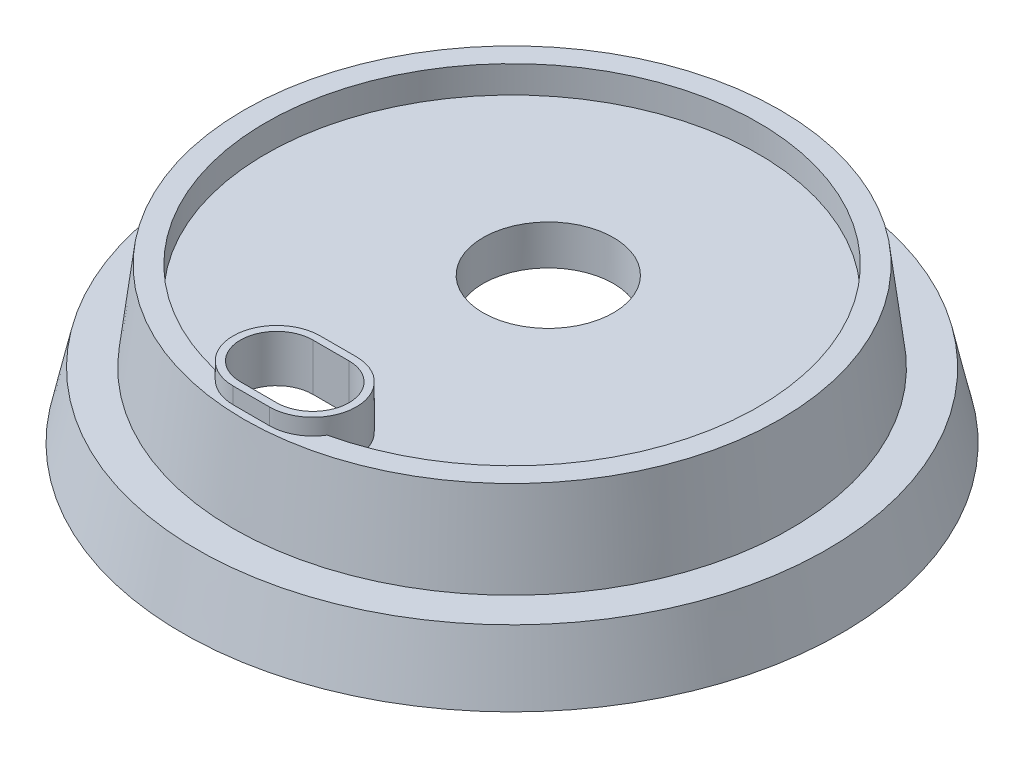
ISO-10303-21;
HEADER;
FILE_DESCRIPTION(('STEP AP214'),'2;1');
FILE_NAME('part.step','',(''),(''),'','','');
FILE_SCHEMA(('AUTOMOTIVE_DESIGN { 1 0 10303 214 1 1 1 1 }'));
ENDSEC;
DATA;
#1=APPLICATION_CONTEXT('core data for automotive mechanical design processes');
#2=APPLICATION_PROTOCOL_DEFINITION('international standard','automotive_design',2000,#1);
#3=PRODUCT_CONTEXT('',#1,'mechanical');
#4=PRODUCT('Part','Part','',(#3));
#5=PRODUCT_RELATED_PRODUCT_CATEGORY('part','',(#4));
#6=PRODUCT_DEFINITION_FORMATION('','',#4);
#7=PRODUCT_DEFINITION_CONTEXT('part definition',#1,'design');
#8=PRODUCT_DEFINITION('design','',#6,#7);
#9=PRODUCT_DEFINITION_SHAPE('','',#8);
#10=(LENGTH_UNIT() NAMED_UNIT(*) SI_UNIT(.MILLI.,.METRE.));
#11=(NAMED_UNIT(*) PLANE_ANGLE_UNIT() SI_UNIT($,.RADIAN.));
#12=(NAMED_UNIT(*) SI_UNIT($,.STERADIAN.) SOLID_ANGLE_UNIT());
#13=UNCERTAINTY_MEASURE_WITH_UNIT(LENGTH_MEASURE(1.E-05),#10,'distance_accuracy_value','');
#14=(GEOMETRIC_REPRESENTATION_CONTEXT(3) GLOBAL_UNCERTAINTY_ASSIGNED_CONTEXT((#13)) GLOBAL_UNIT_ASSIGNED_CONTEXT((#10,
#11,#12)) REPRESENTATION_CONTEXT('',''));
#15=CARTESIAN_POINT('',(0.,0.,0.));
#16=DIRECTION('',(0.,0.,1.));
#17=DIRECTION('',(1.,0.,0.));
#18=AXIS2_PLACEMENT_3D('',#15,#16,#17);
#19=CARTESIAN_POINT('',(0.,8.05,0.));
#20=DIRECTION('',(0.,-1.,0.));
#21=DIRECTION('',(0.,0.,-1.));
#22=AXIS2_PLACEMENT_3D('',#19,#20,#21);
#23=PLANE('',#22);
#24=CARTESIAN_POINT('',(2.5,8.05,30.));
#25=DIRECTION('',(0.,-1.,0.));
#26=DIRECTION('',(0.,0.,-1.));
#27=AXIS2_PLACEMENT_3D('',#24,#25,#26);
#28=CIRCLE('',#27,5.);
#29=CARTESIAN_POINT('',(2.5,8.05,25.));
#30=VERTEX_POINT('',#29);
#31=CARTESIAN_POINT('',(5.3969469058846,8.05,34.0752544245096));
#32=VERTEX_POINT('',#31);
#33=EDGE_CURVE('E63',#30,#32,#28,.T.);
#34=ORIENTED_EDGE('',*,*,#33,.F.);
#35=DIRECTION('',(1.,0.,0.));
#36=VECTOR('',#35,1.);
#37=CARTESIAN_POINT('',(0.,8.05,25.));
#38=LINE('',#37,#36);
#39=CARTESIAN_POINT('',(-2.5,8.05,25.));
#40=VERTEX_POINT('',#39);
#41=EDGE_CURVE('E163',#40,#30,#38,.T.);
#42=ORIENTED_EDGE('',*,*,#41,.F.);
#43=CARTESIAN_POINT('',(-2.5,8.05,30.));
#44=DIRECTION('',(0.,-1.,0.));
#45=DIRECTION('',(0.,0.,-1.));
#46=AXIS2_PLACEMENT_3D('',#43,#44,#45);
#47=CIRCLE('',#46,5.);
#48=CARTESIAN_POINT('',(-5.39694690588459,8.05,34.0752544245096));
#49=VERTEX_POINT('',#48);
#50=EDGE_CURVE('E289',#49,#40,#47,.T.);
#51=ORIENTED_EDGE('',*,*,#50,.F.);
#52=CARTESIAN_POINT('',(0.,8.05,0.));
#53=DIRECTION('',(0.,-1.,0.));
#54=DIRECTION('',(0.,0.,-1.));
#55=AXIS2_PLACEMENT_3D('',#52,#53,#54);
#56=CIRCLE('',#55,34.5);
#57=EDGE_CURVE('E325',#49,#32,#56,.T.);
#58=ORIENTED_EDGE('',*,*,#57,.T.);
#59=EDGE_LOOP('',(#34,#42,#51,#58));
#60=FACE_BOUND('',#59,.T.);
#61=CARTESIAN_POINT('',(0.,8.05,-5.));
#62=DIRECTION('',(0.,-1.,0.));
#63=DIRECTION('',(0.,0.,-1.));
#64=AXIS2_PLACEMENT_3D('',#61,#62,#63);
#65=CIRCLE('',#64,10.);
#66=CARTESIAN_POINT('',(0.,8.05,-15.));
#67=VERTEX_POINT('',#66);
#68=EDGE_CURVE('E527',#67,#67,#65,.T.);
#69=ORIENTED_EDGE('',*,*,#68,.F.);
#70=EDGE_LOOP('',(#69));
#71=FACE_BOUND('',#70,.T.);
#72=ADVANCED_FACE('F39',(#60,#71),#23,.T.);
#73=CARTESIAN_POINT('',(37.,12.3,0.));
#74=DIRECTION('',(0.,1.,0.));
#75=DIRECTION('',(0.,0.,1.));
#76=AXIS2_PLACEMENT_3D('',#73,#74,#75);
#77=PLANE('',#76);
#78=CARTESIAN_POINT('',(0.,12.3,0.));
#79=DIRECTION('',(0.,-1.,0.));
#80=DIRECTION('',(0.,0.,-1.));
#81=AXIS2_PLACEMENT_3D('',#78,#79,#80);
#82=CIRCLE('',#81,37.);
#83=CARTESIAN_POINT('',(0.,12.3,-37.));
#84=VERTEX_POINT('',#83);
#85=EDGE_CURVE('E337',#84,#84,#82,.T.);
#86=ORIENTED_EDGE('',*,*,#85,.F.);
#87=EDGE_LOOP('',(#86));
#88=FACE_BOUND('',#87,.T.);
#89=DIRECTION('',(-1.,0.,0.));
#90=VECTOR('',#89,1.);
#91=CARTESIAN_POINT('',(37.,12.3,36.));
#92=LINE('',#91,#90);
#93=CARTESIAN_POINT('',(2.5,12.3,36.));
#94=VERTEX_POINT('',#93);
#95=CARTESIAN_POINT('',(-2.5,12.3,36.));
#96=VERTEX_POINT('',#95);
#97=EDGE_CURVE('E264',#94,#96,#92,.T.);
#98=ORIENTED_EDGE('',*,*,#97,.T.);
#99=CARTESIAN_POINT('',(-2.5,12.3,30.));
#100=DIRECTION('',(0.,1.,0.));
#101=DIRECTION('',(0.,0.,1.));
#102=AXIS2_PLACEMENT_3D('',#99,#100,#101);
#103=CIRCLE('',#102,6.);
#104=CARTESIAN_POINT('',(-7.61507323691547,12.3,33.1362438969237));
#105=VERTEX_POINT('',#104);
#106=EDGE_CURVE('E166',#96,#105,#103,.F.);
#107=ORIENTED_EDGE('',*,*,#106,.T.);
#108=CARTESIAN_POINT('',(0.,12.3,0.));
#109=DIRECTION('',(0.,-1.,0.));
#110=DIRECTION('',(0.,0.,-1.));
#111=AXIS2_PLACEMENT_3D('',#108,#109,#110);
#112=CIRCLE('',#111,34.);
#113=CARTESIAN_POINT('',(7.61507323691545,12.3,33.1362438969237));
#114=VERTEX_POINT('',#113);
#115=EDGE_CURVE('E333',#105,#114,#112,.T.);
#116=ORIENTED_EDGE('',*,*,#115,.T.);
#117=CARTESIAN_POINT('',(2.5,12.3,30.));
#118=DIRECTION('',(0.,1.,0.));
#119=DIRECTION('',(0.,0.,1.));
#120=AXIS2_PLACEMENT_3D('',#117,#118,#119);
#121=CIRCLE('',#120,6.);
#122=EDGE_CURVE('E260',#114,#94,#121,.F.);
#123=ORIENTED_EDGE('',*,*,#122,.T.);
#124=EDGE_LOOP('',(#98,#107,#116,#123));
#125=FACE_BOUND('',#124,.T.);
#126=ADVANCED_FACE('F387',(#88,#125),#77,.T.);
#127=CARTESIAN_POINT('',(0.,0.,0.));
#128=DIRECTION('',(0.,-1.,0.));
#129=DIRECTION('',(0.,0.,-1.));
#130=AXIS2_PLACEMENT_3D('',#127,#128,#129);
#131=CYLINDRICAL_SURFACE('',#130,34.);
#132=ORIENTED_EDGE('',*,*,#115,.F.);
#133=DIRECTION('',(0.,-1.,0.));
#134=VECTOR('',#133,1.);
#135=CARTESIAN_POINT('',(-7.61507323691547,11.55,33.1362438969237));
#136=LINE('',#135,#134);
#137=CARTESIAN_POINT('',(-7.61507323691547,8.55,33.1362438969237));
#138=VERTEX_POINT('',#137);
#139=EDGE_CURVE('E272',#105,#138,#136,.T.);
#140=ORIENTED_EDGE('',*,*,#139,.T.);
#141=CARTESIAN_POINT('',(0.,8.55,0.));
#142=DIRECTION('',(0.,-1.,0.));
#143=DIRECTION('',(0.,0.,-1.));
#144=AXIS2_PLACEMENT_3D('',#141,#142,#143);
#145=CIRCLE('',#144,34.);
#146=CARTESIAN_POINT('',(7.61507323691545,8.55,33.1362438969237));
#147=VERTEX_POINT('',#146);
#148=EDGE_CURVE('E329',#138,#147,#145,.T.);
#149=ORIENTED_EDGE('',*,*,#148,.T.);
#150=DIRECTION('',(0.,-1.,0.));
#151=VECTOR('',#150,1.);
#152=CARTESIAN_POINT('',(7.61507323691545,11.55,33.1362438969237));
#153=LINE('',#152,#151);
#154=EDGE_CURVE('E256',#147,#114,#153,.F.);
#155=ORIENTED_EDGE('',*,*,#154,.T.);
#156=EDGE_LOOP('',(#132,#140,#149,#155));
#157=FACE_BOUND('',#156,.T.);
#158=ADVANCED_FACE('F390',(#157),#131,.F.);
#159=CARTESIAN_POINT('',(0.,8.55,0.));
#160=DIRECTION('',(0.,1.,0.));
#161=DIRECTION('',(0.,0.,1.));
#162=AXIS2_PLACEMENT_3D('',#159,#160,#161);
#163=PLANE('',#162);
#164=CARTESIAN_POINT('',(0.,8.55,-5.));
#165=DIRECTION('',(0.,1.,0.));
#166=DIRECTION('',(0.,0.,1.));
#167=AXIS2_PLACEMENT_3D('',#164,#165,#166);
#168=CIRCLE('',#167,9.);
#169=CARTESIAN_POINT('',(0.,8.55,4.));
#170=VERTEX_POINT('',#169);
#171=EDGE_CURVE('E196',#170,#170,#168,.T.);
#172=ORIENTED_EDGE('',*,*,#171,.F.);
#173=EDGE_LOOP('',(#172));
#174=FACE_BOUND('',#173,.T.);
#175=ORIENTED_EDGE('',*,*,#148,.F.);
#176=CARTESIAN_POINT('',(-2.5,8.55,30.));
#177=DIRECTION('',(0.,1.,0.));
#178=DIRECTION('',(0.,0.,1.));
#179=AXIS2_PLACEMENT_3D('',#176,#177,#178);
#180=CIRCLE('',#179,6.);
#181=CARTESIAN_POINT('',(-2.5,8.55,24.));
#182=VERTEX_POINT('',#181);
#183=EDGE_CURVE('E218',#182,#138,#180,.T.);
#184=ORIENTED_EDGE('',*,*,#183,.F.);
#185=DIRECTION('',(-1.,0.,0.));
#186=VECTOR('',#185,1.);
#187=CARTESIAN_POINT('',(-2.5,8.55,24.));
#188=LINE('',#187,#186);
#189=CARTESIAN_POINT('',(2.5,8.55,24.));
#190=VERTEX_POINT('',#189);
#191=EDGE_CURVE('E208',#190,#182,#188,.T.);
#192=ORIENTED_EDGE('',*,*,#191,.F.);
#193=CARTESIAN_POINT('',(2.5,8.55,30.));
#194=DIRECTION('',(0.,1.,0.));
#195=DIRECTION('',(0.,0.,-1.));
#196=AXIS2_PLACEMENT_3D('',#193,#194,#195);
#197=CIRCLE('',#196,6.);
#198=EDGE_CURVE('E225',#147,#190,#197,.T.);
#199=ORIENTED_EDGE('',*,*,#198,.F.);
#200=EDGE_LOOP('',(#175,#184,#192,#199));
#201=FACE_BOUND('',#200,.T.);
#202=ADVANCED_FACE('F376',(#174,#201),#163,.T.);
#203=CARTESIAN_POINT('',(0.,0.,0.));
#204=DIRECTION('',(0.,-1.,0.));
#205=DIRECTION('',(0.,0.,-1.));
#206=AXIS2_PLACEMENT_3D('',#203,#204,#205);
#207=CYLINDRICAL_SURFACE('',#206,34.5);
#208=DIRECTION('',(0.,1.,0.));
#209=VECTOR('',#208,1.);
#210=CARTESIAN_POINT('',(-5.39694690588461,8.55,34.0752544245097));
#211=LINE('',#210,#209);
#212=CARTESIAN_POINT('',(-5.39694690588461,8.55,34.0752544245097));
#213=VERTEX_POINT('',#212);
#214=EDGE_CURVE('E281',#213,#49,#211,.F.);
#215=ORIENTED_EDGE('',*,*,#214,.F.);
#216=CARTESIAN_POINT('',(0.,8.55,0.));
#217=DIRECTION('',(0.,1.,0.));
#218=DIRECTION('',(0.,0.,1.));
#219=AXIS2_PLACEMENT_3D('',#216,#217,#218);
#220=CIRCLE('',#219,34.5);
#221=CARTESIAN_POINT('',(-7.18972518760356,8.55,33.742522901033));
#222=VERTEX_POINT('',#221);
#223=EDGE_CURVE('E251',#213,#222,#220,.F.);
#224=ORIENTED_EDGE('',*,*,#223,.T.);
#225=DIRECTION('',(0.,-1.,0.));
#226=VECTOR('',#225,1.);
#227=CARTESIAN_POINT('',(-7.18972518760356,11.55,33.742522901033));
#228=LINE('',#227,#226);
#229=CARTESIAN_POINT('',(-7.18972518760355,11.8,33.742522901033));
#230=VERTEX_POINT('',#229);
#231=EDGE_CURVE('E268',#222,#230,#228,.F.);
#232=ORIENTED_EDGE('',*,*,#231,.T.);
#233=CARTESIAN_POINT('',(0.,11.8,0.));
#234=DIRECTION('',(0.,-1.,0.));
#235=DIRECTION('',(0.,0.,-1.));
#236=AXIS2_PLACEMENT_3D('',#233,#234,#235);
#237=CIRCLE('',#236,34.5);
#238=CARTESIAN_POINT('',(7.18972518760355,11.8,33.742522901033));
#239=VERTEX_POINT('',#238);
#240=EDGE_CURVE('E321',#230,#239,#237,.T.);
#241=ORIENTED_EDGE('',*,*,#240,.T.);
#242=DIRECTION('',(0.,-1.,0.));
#243=VECTOR('',#242,1.);
#244=CARTESIAN_POINT('',(7.18972518760356,11.55,33.742522901033));
#245=LINE('',#244,#243);
#246=CARTESIAN_POINT('',(7.18972518760356,8.55,33.742522901033));
#247=VERTEX_POINT('',#246);
#248=EDGE_CURVE('E252',#239,#247,#245,.T.);
#249=ORIENTED_EDGE('',*,*,#248,.T.);
#250=CARTESIAN_POINT('',(5.39694690588462,8.55,34.0752544245097));
#251=VERTEX_POINT('',#250);
#252=EDGE_CURVE('E247',#247,#251,#220,.F.);
#253=ORIENTED_EDGE('',*,*,#252,.T.);
#254=DIRECTION('',(0.,1.,0.));
#255=VECTOR('',#254,1.);
#256=CARTESIAN_POINT('',(5.39694690588461,8.55,34.0752544245097));
#257=LINE('',#256,#255);
#258=EDGE_CURVE('E292',#32,#251,#257,.T.);
#259=ORIENTED_EDGE('',*,*,#258,.F.);
#260=ORIENTED_EDGE('',*,*,#57,.F.);
#261=EDGE_LOOP('',(#215,#224,#232,#241,#249,#253,#259,#260));
#262=FACE_BOUND('',#261,.T.);
#263=ADVANCED_FACE('F414',(#262),#207,.T.);
#264=CARTESIAN_POINT('',(36.5572713066326,11.8,0.));
#265=DIRECTION('',(0.,-1.,0.));
#266=DIRECTION('',(0.,0.,-1.));
#267=AXIS2_PLACEMENT_3D('',#264,#265,#266);
#268=PLANE('',#267);
#269=CARTESIAN_POINT('',(0.,11.8,0.));
#270=DIRECTION('',(0.,-1.,0.));
#271=DIRECTION('',(0.,0.,-1.));
#272=AXIS2_PLACEMENT_3D('',#269,#270,#271);
#273=CIRCLE('',#272,36.5572713066326);
#274=CARTESIAN_POINT('',(0.,11.8,-36.5572713066326));
#275=VERTEX_POINT('',#274);
#276=EDGE_CURVE('E317',#275,#275,#273,.T.);
#277=ORIENTED_EDGE('',*,*,#276,.T.);
#278=EDGE_LOOP('',(#277));
#279=FACE_BOUND('',#278,.T.);
#280=ORIENTED_EDGE('',*,*,#240,.F.);
#281=CARTESIAN_POINT('',(-2.5,11.8,30.));
#282=DIRECTION('',(0.,-1.,0.));
#283=DIRECTION('',(0.,0.,-1.));
#284=AXIS2_PLACEMENT_3D('',#281,#282,#283);
#285=CIRCLE('',#284,6.);
#286=CARTESIAN_POINT('',(-2.5,11.8,36.));
#287=VERTEX_POINT('',#286);
#288=EDGE_CURVE('E11',#230,#287,#285,.F.);
#289=ORIENTED_EDGE('',*,*,#288,.T.);
#290=DIRECTION('',(1.,0.,0.));
#291=VECTOR('',#290,1.);
#292=CARTESIAN_POINT('',(36.5572713066327,11.8,36.));
#293=LINE('',#292,#291);
#294=CARTESIAN_POINT('',(2.5,11.8,36.));
#295=VERTEX_POINT('',#294);
#296=EDGE_CURVE('E48',#287,#295,#293,.T.);
#297=ORIENTED_EDGE('',*,*,#296,.T.);
#298=CARTESIAN_POINT('',(2.5,11.8,30.));
#299=DIRECTION('',(0.,-1.,0.));
#300=DIRECTION('',(0.,0.,-1.));
#301=AXIS2_PLACEMENT_3D('',#298,#299,#300);
#302=CIRCLE('',#301,6.);
#303=EDGE_CURVE('E347',#295,#239,#302,.F.);
#304=ORIENTED_EDGE('',*,*,#303,.T.);
#305=EDGE_LOOP('',(#280,#289,#297,#304));
#306=FACE_BOUND('',#305,.T.);
#307=ADVANCED_FACE('F354',(#279,#306),#268,.T.);
#308=CARTESIAN_POINT('',(38.5,0.,0.));
#309=DIRECTION('',(0.,1.,0.));
#310=DIRECTION('',(0.,0.,1.));
#311=AXIS2_PLACEMENT_3D('',#308,#309,#310);
#312=PLANE('',#311);
#313=CARTESIAN_POINT('',(0.,0.,0.));
#314=DIRECTION('',(0.,-1.,0.));
#315=DIRECTION('',(0.,0.,-1.));
#316=AXIS2_PLACEMENT_3D('',#313,#314,#315);
#317=CIRCLE('',#316,38.5);
#318=CARTESIAN_POINT('',(0.,0.,-38.5));
#319=VERTEX_POINT('',#318);
#320=EDGE_CURVE('E341',#319,#319,#317,.T.);
#321=ORIENTED_EDGE('',*,*,#320,.T.);
#322=EDGE_LOOP('',(#321));
#323=FACE_BOUND('',#322,.T.);
#324=CARTESIAN_POINT('',(0.,0.,0.));
#325=DIRECTION('',(0.,-1.,0.));
#326=DIRECTION('',(0.,0.,-1.));
#327=AXIS2_PLACEMENT_3D('',#324,#325,#326);
#328=CIRCLE('',#327,43.5);
#329=CARTESIAN_POINT('',(0.,0.,-43.5));
#330=VERTEX_POINT('',#329);
#331=EDGE_CURVE('E297',#330,#330,#328,.T.);
#332=ORIENTED_EDGE('',*,*,#331,.F.);
#333=EDGE_LOOP('',(#332));
#334=FACE_BOUND('',#333,.T.);
#335=ADVANCED_FACE('F41',(#323,#334),#312,.T.);
#336=CARTESIAN_POINT('',(0.,0.,0.));
#337=DIRECTION('',(0.,-1.,0.));
#338=DIRECTION('',(0.,0.,-1.));
#339=AXIS2_PLACEMENT_3D('',#336,#337,#338);
#340=CONICAL_SURFACE('',#339,38.5,0.121352000570764);
#341=ORIENTED_EDGE('',*,*,#85,.T.);
#342=EDGE_LOOP('',(#341));
#343=FACE_BOUND('',#342,.T.);
#344=ORIENTED_EDGE('',*,*,#320,.F.);
#345=EDGE_LOOP('',(#344));
#346=FACE_BOUND('',#345,.T.);
#347=ADVANCED_FACE('F420',(#343,#346),#340,.T.);
#348=CARTESIAN_POINT('',(0.,11.8,0.));
#349=DIRECTION('',(0.,-1.,0.));
#350=DIRECTION('',(0.,0.,-1.));
#351=AXIS2_PLACEMENT_3D('',#348,#349,#350);
#352=CONICAL_SURFACE('',#351,36.5572713066326,0.121352000570764);
#353=CARTESIAN_POINT('',(0.,-0.5,0.));
#354=DIRECTION('',(0.,-1.,0.));
#355=DIRECTION('',(0.,0.,-1.));
#356=AXIS2_PLACEMENT_3D('',#353,#354,#355);
#357=CIRCLE('',#356,38.0572713066326);
#358=CARTESIAN_POINT('',(0.,-0.5,-38.0572713066326));
#359=VERTEX_POINT('',#358);
#360=EDGE_CURVE('E313',#359,#359,#357,.T.);
#361=ORIENTED_EDGE('',*,*,#360,.T.);
#362=EDGE_LOOP('',(#361));
#363=FACE_BOUND('',#362,.T.);
#364=ORIENTED_EDGE('',*,*,#276,.F.);
#365=EDGE_LOOP('',(#364));
#366=FACE_BOUND('',#365,.T.);
#367=ADVANCED_FACE('F422',(#363,#366),#352,.F.);
#368=CARTESIAN_POINT('',(38.0572713066326,-0.5,0.));
#369=DIRECTION('',(0.,-1.,0.));
#370=DIRECTION('',(0.,0.,-1.));
#371=AXIS2_PLACEMENT_3D('',#368,#369,#370);
#372=PLANE('',#371);
#373=CARTESIAN_POINT('',(0.,-0.5,0.));
#374=DIRECTION('',(0.,-1.,0.));
#375=DIRECTION('',(0.,0.,-1.));
#376=AXIS2_PLACEMENT_3D('',#373,#374,#375);
#377=CIRCLE('',#376,43.0989141968171);
#378=CARTESIAN_POINT('',(0.,-0.5,-43.0989141968171));
#379=VERTEX_POINT('',#378);
#380=EDGE_CURVE('E309',#379,#379,#377,.T.);
#381=ORIENTED_EDGE('',*,*,#380,.T.);
#382=EDGE_LOOP('',(#381));
#383=FACE_BOUND('',#382,.T.);
#384=ORIENTED_EDGE('',*,*,#360,.F.);
#385=EDGE_LOOP('',(#384));
#386=FACE_BOUND('',#385,.T.);
#387=ADVANCED_FACE('F428',(#383,#386),#372,.T.);
#388=CARTESIAN_POINT('',(0.,-0.5,0.));
#389=DIRECTION('',(0.,-1.,0.));
#390=DIRECTION('',(0.,0.,-1.));
#391=AXIS2_PLACEMENT_3D('',#388,#389,#390);
#392=CONICAL_SURFACE('',#391,43.0989141968171,0.218668945873942);
#393=CARTESIAN_POINT('',(0.,-9.10846522890933,0.));
#394=DIRECTION('',(0.,-1.,0.));
#395=DIRECTION('',(0.,0.,-1.));
#396=AXIS2_PLACEMENT_3D('',#393,#394,#395);
#397=CIRCLE('',#396,45.011906469908);
#398=CARTESIAN_POINT('',(0.,-9.10846522890933,-45.011906469908));
#399=VERTEX_POINT('',#398);
#400=EDGE_CURVE('E305',#399,#399,#397,.T.);
#401=ORIENTED_EDGE('',*,*,#400,.T.);
#402=EDGE_LOOP('',(#401));
#403=FACE_BOUND('',#402,.T.);
#404=ORIENTED_EDGE('',*,*,#380,.F.);
#405=EDGE_LOOP('',(#404));
#406=FACE_BOUND('',#405,.T.);
#407=ADVANCED_FACE('F447',(#403,#406),#392,.F.);
#408=CARTESIAN_POINT('',(0.,-9.10846522890933,0.));
#409=DIRECTION('',(0.,1.,0.));
#410=DIRECTION('',(0.,0.,1.));
#411=AXIS2_PLACEMENT_3D('',#408,#409,#410);
#412=CONICAL_SURFACE('',#411,45.011906469908,1.35212738092096);
#413=CARTESIAN_POINT('',(0.,-9.,0.));
#414=DIRECTION('',(0.,-1.,0.));
#415=DIRECTION('',(0.,0.,-1.));
#416=AXIS2_PLACEMENT_3D('',#413,#414,#415);
#417=CIRCLE('',#416,45.5);
#418=CARTESIAN_POINT('',(0.,-9.,-45.5));
#419=VERTEX_POINT('',#418);
#420=EDGE_CURVE('E301',#419,#419,#417,.T.);
#421=ORIENTED_EDGE('',*,*,#420,.T.);
#422=EDGE_LOOP('',(#421));
#423=FACE_BOUND('',#422,.T.);
#424=ORIENTED_EDGE('',*,*,#400,.F.);
#425=EDGE_LOOP('',(#424));
#426=FACE_BOUND('',#425,.T.);
#427=ADVANCED_FACE('F441',(#423,#426),#412,.T.);
#428=CARTESIAN_POINT('',(0.,-9.,0.));
#429=DIRECTION('',(0.,-1.,0.));
#430=DIRECTION('',(0.,0.,-1.));
#431=AXIS2_PLACEMENT_3D('',#428,#429,#430);
#432=CONICAL_SURFACE('',#431,45.5,0.218668945873942);
#433=ORIENTED_EDGE('',*,*,#331,.T.);
#434=EDGE_LOOP('',(#433));
#435=FACE_BOUND('',#434,.T.);
#436=ORIENTED_EDGE('',*,*,#420,.F.);
#437=EDGE_LOOP('',(#436));
#438=FACE_BOUND('',#437,.T.);
#439=ADVANCED_FACE('F438',(#435,#438),#432,.T.);
#440=CARTESIAN_POINT('',(2.5,3.55,30.));
#441=DIRECTION('',(0.,1.,0.));
#442=DIRECTION('',(0.,0.,1.));
#443=AXIS2_PLACEMENT_3D('',#440,#441,#442);
#444=CYLINDRICAL_SURFACE('',#443,5.);
#445=ORIENTED_EDGE('',*,*,#258,.T.);
#446=CARTESIAN_POINT('',(2.5,8.55,30.));
#447=DIRECTION('',(0.,1.,0.));
#448=DIRECTION('',(0.,0.,-1.));
#449=AXIS2_PLACEMENT_3D('',#446,#447,#448);
#450=CIRCLE('',#449,5.);
#451=CARTESIAN_POINT('',(2.5,8.55,35.));
#452=VERTEX_POINT('',#451);
#453=EDGE_CURVE('E192',#452,#251,#450,.T.);
#454=ORIENTED_EDGE('',*,*,#453,.F.);
#455=DIRECTION('',(0.,1.,0.));
#456=VECTOR('',#455,1.);
#457=CARTESIAN_POINT('',(2.5,3.55,35.));
#458=LINE('',#457,#456);
#459=CARTESIAN_POINT('',(2.5,14.55,35.));
#460=VERTEX_POINT('',#459);
#461=EDGE_CURVE('E172',#452,#460,#458,.T.);
#462=ORIENTED_EDGE('',*,*,#461,.T.);
#463=CARTESIAN_POINT('',(2.5,14.55,30.));
#464=DIRECTION('',(0.,1.,0.));
#465=DIRECTION('',(0.,0.,-1.));
#466=AXIS2_PLACEMENT_3D('',#463,#464,#465);
#467=CIRCLE('',#466,5.);
#468=CARTESIAN_POINT('',(2.5,14.55,25.));
#469=VERTEX_POINT('',#468);
#470=EDGE_CURVE('E169',#460,#469,#467,.T.);
#471=ORIENTED_EDGE('',*,*,#470,.T.);
#472=DIRECTION('',(0.,1.,0.));
#473=VECTOR('',#472,1.);
#474=CARTESIAN_POINT('',(2.5,3.55,25.));
#475=LINE('',#474,#473);
#476=EDGE_CURVE('E155',#30,#469,#475,.T.);
#477=ORIENTED_EDGE('',*,*,#476,.F.);
#478=ORIENTED_EDGE('',*,*,#33,.T.);
#479=EDGE_LOOP('',(#445,#454,#462,#471,#477,#478));
#480=FACE_BOUND('',#479,.T.);
#481=ADVANCED_FACE('F170',(#480),#444,.F.);
#482=CARTESIAN_POINT('',(-2.5,3.55,35.));
#483=DIRECTION('',(0.,0.,1.));
#484=DIRECTION('',(1.,0.,0.));
#485=AXIS2_PLACEMENT_3D('',#482,#483,#484);
#486=PLANE('',#485);
#487=DIRECTION('',(0.,1.,0.));
#488=VECTOR('',#487,1.);
#489=CARTESIAN_POINT('',(-2.5,3.55,35.));
#490=LINE('',#489,#488);
#491=CARTESIAN_POINT('',(-2.5,8.55,35.));
#492=VERTEX_POINT('',#491);
#493=CARTESIAN_POINT('',(-2.5,14.55,35.));
#494=VERTEX_POINT('',#493);
#495=EDGE_CURVE('E282',#492,#494,#490,.T.);
#496=ORIENTED_EDGE('',*,*,#495,.T.);
#497=DIRECTION('',(1.,0.,0.));
#498=VECTOR('',#497,1.);
#499=CARTESIAN_POINT('',(-2.5,14.55,35.));
#500=LINE('',#499,#498);
#501=EDGE_CURVE('E185',#494,#460,#500,.T.);
#502=ORIENTED_EDGE('',*,*,#501,.T.);
#503=ORIENTED_EDGE('',*,*,#461,.F.);
#504=DIRECTION('',(1.,0.,0.));
#505=VECTOR('',#504,1.);
#506=CARTESIAN_POINT('',(-2.5,8.55,35.));
#507=LINE('',#506,#505);
#508=EDGE_CURVE('E177',#492,#452,#507,.T.);
#509=ORIENTED_EDGE('',*,*,#508,.F.);
#510=EDGE_LOOP('',(#496,#502,#503,#509));
#511=FACE_BOUND('',#510,.T.);
#512=ADVANCED_FACE('F471',(#511),#486,.F.);
#513=CARTESIAN_POINT('',(-2.5,3.55,30.));
#514=DIRECTION('',(0.,1.,0.));
#515=DIRECTION('',(0.,0.,1.));
#516=AXIS2_PLACEMENT_3D('',#513,#514,#515);
#517=CYLINDRICAL_SURFACE('',#516,5.);
#518=CARTESIAN_POINT('',(-2.5,14.55,30.));
#519=DIRECTION('',(0.,1.,0.));
#520=DIRECTION('',(0.,0.,1.));
#521=AXIS2_PLACEMENT_3D('',#518,#519,#520);
#522=CIRCLE('',#521,5.);
#523=CARTESIAN_POINT('',(-2.5,14.55,25.));
#524=VERTEX_POINT('',#523);
#525=EDGE_CURVE('E181',#524,#494,#522,.T.);
#526=ORIENTED_EDGE('',*,*,#525,.T.);
#527=ORIENTED_EDGE('',*,*,#495,.F.);
#528=CARTESIAN_POINT('',(-2.5,8.55,30.));
#529=DIRECTION('',(0.,1.,0.));
#530=DIRECTION('',(0.,0.,1.));
#531=AXIS2_PLACEMENT_3D('',#528,#529,#530);
#532=CIRCLE('',#531,5.);
#533=EDGE_CURVE('E195',#213,#492,#532,.T.);
#534=ORIENTED_EDGE('',*,*,#533,.F.);
#535=ORIENTED_EDGE('',*,*,#214,.T.);
#536=ORIENTED_EDGE('',*,*,#50,.T.);
#537=DIRECTION('',(0.,1.,0.));
#538=VECTOR('',#537,1.);
#539=CARTESIAN_POINT('',(-2.5,3.55,25.));
#540=LINE('',#539,#538);
#541=EDGE_CURVE('E165',#40,#524,#540,.T.);
#542=ORIENTED_EDGE('',*,*,#541,.T.);
#543=EDGE_LOOP('',(#526,#527,#534,#535,#536,#542));
#544=FACE_BOUND('',#543,.T.);
#545=ADVANCED_FACE('F474',(#544),#517,.F.);
#546=CARTESIAN_POINT('',(-2.5,3.55,25.));
#547=DIRECTION('',(0.,0.,-1.));
#548=DIRECTION('',(-1.,0.,0.));
#549=AXIS2_PLACEMENT_3D('',#546,#547,#548);
#550=PLANE('',#549);
#551=ORIENTED_EDGE('',*,*,#476,.T.);
#552=DIRECTION('',(-1.,0.,0.));
#553=VECTOR('',#552,1.);
#554=CARTESIAN_POINT('',(-2.5,14.55,25.));
#555=LINE('',#554,#553);
#556=EDGE_CURVE('E160',#469,#524,#555,.T.);
#557=ORIENTED_EDGE('',*,*,#556,.T.);
#558=ORIENTED_EDGE('',*,*,#541,.F.);
#559=ORIENTED_EDGE('',*,*,#41,.T.);
#560=EDGE_LOOP('',(#551,#557,#558,#559));
#561=FACE_BOUND('',#560,.T.);
#562=ADVANCED_FACE('F157',(#561),#550,.F.);
#563=CARTESIAN_POINT('',(-2.5,14.55,24.));
#564=DIRECTION('',(0.,0.,1.));
#565=DIRECTION('',(1.,0.,0.));
#566=AXIS2_PLACEMENT_3D('',#563,#564,#565);
#567=PLANE('',#566);
#568=ORIENTED_EDGE('',*,*,#191,.T.);
#569=DIRECTION('',(0.,-1.,0.));
#570=VECTOR('',#569,1.);
#571=CARTESIAN_POINT('',(-2.5,14.55,24.));
#572=LINE('',#571,#570);
#573=CARTESIAN_POINT('',(-2.5,14.55,24.));
#574=VERTEX_POINT('',#573);
#575=EDGE_CURVE('E217',#574,#182,#572,.T.);
#576=ORIENTED_EDGE('',*,*,#575,.F.);
#577=DIRECTION('',(-1.,0.,0.));
#578=VECTOR('',#577,1.);
#579=CARTESIAN_POINT('',(-2.5,14.55,24.));
#580=LINE('',#579,#578);
#581=CARTESIAN_POINT('',(2.5,14.55,24.));
#582=VERTEX_POINT('',#581);
#583=EDGE_CURVE('E214',#582,#574,#580,.T.);
#584=ORIENTED_EDGE('',*,*,#583,.F.);
#585=DIRECTION('',(0.,-1.,0.));
#586=VECTOR('',#585,1.);
#587=CARTESIAN_POINT('',(2.5,14.55,24.));
#588=LINE('',#587,#586);
#589=EDGE_CURVE('E55',#582,#190,#588,.T.);
#590=ORIENTED_EDGE('',*,*,#589,.T.);
#591=EDGE_LOOP('',(#568,#576,#584,#590));
#592=FACE_BOUND('',#591,.T.);
#593=ADVANCED_FACE('F378',(#592),#567,.F.);
#594=CARTESIAN_POINT('',(-2.5,14.55,30.));
#595=DIRECTION('',(0.,1.,0.));
#596=DIRECTION('',(0.,0.,1.));
#597=AXIS2_PLACEMENT_3D('',#594,#595,#596);
#598=PLANE('',#597);
#599=CARTESIAN_POINT('',(-2.5,14.55,30.));
#600=DIRECTION('',(0.,1.,0.));
#601=DIRECTION('',(0.,0.,1.));
#602=AXIS2_PLACEMENT_3D('',#599,#600,#601);
#603=CIRCLE('',#602,6.);
#604=CARTESIAN_POINT('',(-2.5,14.55,36.));
#605=VERTEX_POINT('',#604);
#606=EDGE_CURVE('E203',#574,#605,#603,.T.);
#607=ORIENTED_EDGE('',*,*,#606,.T.);
#608=DIRECTION('',(1.,0.,0.));
#609=VECTOR('',#608,1.);
#610=CARTESIAN_POINT('',(-2.5,14.55,36.));
#611=LINE('',#610,#609);
#612=CARTESIAN_POINT('',(2.5,14.55,36.));
#613=VERTEX_POINT('',#612);
#614=EDGE_CURVE('E207',#605,#613,#611,.T.);
#615=ORIENTED_EDGE('',*,*,#614,.T.);
#616=CARTESIAN_POINT('',(2.5,14.55,30.));
#617=DIRECTION('',(0.,1.,0.));
#618=DIRECTION('',(0.,0.,-1.));
#619=AXIS2_PLACEMENT_3D('',#616,#617,#618);
#620=CIRCLE('',#619,6.);
#621=EDGE_CURVE('E211',#613,#582,#620,.T.);
#622=ORIENTED_EDGE('',*,*,#621,.T.);
#623=ORIENTED_EDGE('',*,*,#583,.T.);
#624=EDGE_LOOP('',(#607,#615,#622,#623));
#625=FACE_BOUND('',#624,.T.);
#626=ORIENTED_EDGE('',*,*,#556,.F.);
#627=ORIENTED_EDGE('',*,*,#470,.F.);
#628=ORIENTED_EDGE('',*,*,#501,.F.);
#629=ORIENTED_EDGE('',*,*,#525,.F.);
#630=EDGE_LOOP('',(#626,#627,#628,#629));
#631=FACE_BOUND('',#630,.T.);
#632=ADVANCED_FACE('F179',(#625,#631),#598,.T.);
#633=CARTESIAN_POINT('',(2.5,14.55,30.));
#634=DIRECTION('',(0.,-1.,0.));
#635=DIRECTION('',(0.,0.,-1.));
#636=AXIS2_PLACEMENT_3D('',#633,#634,#635);
#637=CYLINDRICAL_SURFACE('',#636,6.);
#638=ORIENTED_EDGE('',*,*,#122,.F.);
#639=ORIENTED_EDGE('',*,*,#154,.F.);
#640=ORIENTED_EDGE('',*,*,#198,.T.);
#641=ORIENTED_EDGE('',*,*,#589,.F.);
#642=ORIENTED_EDGE('',*,*,#621,.F.);
#643=DIRECTION('',(0.,-1.,0.));
#644=VECTOR('',#643,1.);
#645=CARTESIAN_POINT('',(2.5,14.55,36.));
#646=LINE('',#645,#644);
#647=EDGE_CURVE('E238',#613,#94,#646,.T.);
#648=ORIENTED_EDGE('',*,*,#647,.T.);
#649=EDGE_LOOP('',(#638,#639,#640,#641,#642,#648));
#650=FACE_BOUND('',#649,.T.);
#651=ADVANCED_FACE('F371',(#650),#637,.T.);
#652=CARTESIAN_POINT('',(-2.5,14.55,36.));
#653=DIRECTION('',(0.,0.,-1.));
#654=DIRECTION('',(-1.,0.,0.));
#655=AXIS2_PLACEMENT_3D('',#652,#653,#654);
#656=PLANE('',#655);
#657=ORIENTED_EDGE('',*,*,#97,.F.);
#658=ORIENTED_EDGE('',*,*,#647,.F.);
#659=ORIENTED_EDGE('',*,*,#614,.F.);
#660=DIRECTION('',(0.,-1.,0.));
#661=VECTOR('',#660,1.);
#662=CARTESIAN_POINT('',(-2.5,14.55,36.));
#663=LINE('',#662,#661);
#664=EDGE_CURVE('E243',#605,#96,#663,.T.);
#665=ORIENTED_EDGE('',*,*,#664,.T.);
#666=EDGE_LOOP('',(#657,#658,#659,#665));
#667=FACE_BOUND('',#666,.T.);
#668=ADVANCED_FACE('F391',(#667),#656,.F.);
#669=CARTESIAN_POINT('',(-2.5,14.55,30.));
#670=DIRECTION('',(0.,-1.,0.));
#671=DIRECTION('',(0.,0.,-1.));
#672=AXIS2_PLACEMENT_3D('',#669,#670,#671);
#673=CYLINDRICAL_SURFACE('',#672,6.);
#674=ORIENTED_EDGE('',*,*,#106,.F.);
#675=ORIENTED_EDGE('',*,*,#664,.F.);
#676=ORIENTED_EDGE('',*,*,#606,.F.);
#677=ORIENTED_EDGE('',*,*,#575,.T.);
#678=ORIENTED_EDGE('',*,*,#183,.T.);
#679=ORIENTED_EDGE('',*,*,#139,.F.);
#680=EDGE_LOOP('',(#674,#675,#676,#677,#678,#679));
#681=FACE_BOUND('',#680,.T.);
#682=ADVANCED_FACE('F381',(#681),#673,.T.);
#683=CARTESIAN_POINT('',(-2.5,8.55,30.));
#684=DIRECTION('',(0.,1.,0.));
#685=DIRECTION('',(0.,0.,1.));
#686=AXIS2_PLACEMENT_3D('',#683,#684,#685);
#687=PLANE('',#686);
#688=ORIENTED_EDGE('',*,*,#223,.F.);
#689=ORIENTED_EDGE('',*,*,#533,.T.);
#690=ORIENTED_EDGE('',*,*,#508,.T.);
#691=ORIENTED_EDGE('',*,*,#453,.T.);
#692=ORIENTED_EDGE('',*,*,#252,.F.);
#693=CARTESIAN_POINT('',(2.5,8.55,36.));
#694=VERTEX_POINT('',#693);
#695=EDGE_CURVE('E226',#694,#247,#197,.T.);
#696=ORIENTED_EDGE('',*,*,#695,.F.);
#697=DIRECTION('',(1.,0.,0.));
#698=VECTOR('',#697,1.);
#699=CARTESIAN_POINT('',(-2.5,8.55,36.));
#700=LINE('',#699,#698);
#701=CARTESIAN_POINT('',(-2.5,8.55,36.));
#702=VERTEX_POINT('',#701);
#703=EDGE_CURVE('E221',#702,#694,#700,.T.);
#704=ORIENTED_EDGE('',*,*,#703,.F.);
#705=EDGE_CURVE('E191',#222,#702,#180,.T.);
#706=ORIENTED_EDGE('',*,*,#705,.F.);
#707=EDGE_LOOP('',(#688,#689,#690,#691,#692,#696,#704,#706));
#708=FACE_BOUND('',#707,.T.);
#709=ADVANCED_FACE('F398',(#708),#687,.F.);
#710=ORIENTED_EDGE('',*,*,#231,.F.);
#711=ORIENTED_EDGE('',*,*,#705,.T.);
#712=EDGE_CURVE('E242',#287,#702,#663,.T.);
#713=ORIENTED_EDGE('',*,*,#712,.F.);
#714=ORIENTED_EDGE('',*,*,#288,.F.);
#715=EDGE_LOOP('',(#710,#711,#713,#714));
#716=FACE_BOUND('',#715,.T.);
#717=ADVANCED_FACE('F361',(#716),#673,.T.);
#718=ORIENTED_EDGE('',*,*,#296,.F.);
#719=ORIENTED_EDGE('',*,*,#712,.T.);
#720=ORIENTED_EDGE('',*,*,#703,.T.);
#721=EDGE_CURVE('E237',#295,#694,#646,.T.);
#722=ORIENTED_EDGE('',*,*,#721,.F.);
#723=EDGE_LOOP('',(#718,#719,#720,#722));
#724=FACE_BOUND('',#723,.T.);
#725=ADVANCED_FACE('F358',(#724),#656,.F.);
#726=ORIENTED_EDGE('',*,*,#248,.F.);
#727=ORIENTED_EDGE('',*,*,#303,.F.);
#728=ORIENTED_EDGE('',*,*,#721,.T.);
#729=ORIENTED_EDGE('',*,*,#695,.T.);
#730=EDGE_LOOP('',(#726,#727,#728,#729));
#731=FACE_BOUND('',#730,.T.);
#732=ADVANCED_FACE('F401',(#731),#637,.T.);
#733=CARTESIAN_POINT('',(0.,2.55,-5.));
#734=DIRECTION('',(0.,1.,0.));
#735=DIRECTION('',(0.,0.,1.));
#736=AXIS2_PLACEMENT_3D('',#733,#734,#735);
#737=CYLINDRICAL_SURFACE('',#736,9.);
#738=ORIENTED_EDGE('',*,*,#171,.T.);
#739=EDGE_LOOP('',(#738));
#740=FACE_BOUND('',#739,.T.);
#741=CARTESIAN_POINT('',(0.,3.05,-5.));
#742=DIRECTION('',(0.,-1.,0.));
#743=DIRECTION('',(0.,0.,-1.));
#744=AXIS2_PLACEMENT_3D('',#741,#742,#743);
#745=CIRCLE('',#744,9.);
#746=CARTESIAN_POINT('',(0.,3.05,-14.));
#747=VERTEX_POINT('',#746);
#748=EDGE_CURVE('E529',#747,#747,#745,.T.);
#749=ORIENTED_EDGE('',*,*,#748,.T.);
#750=EDGE_LOOP('',(#749));
#751=FACE_BOUND('',#750,.T.);
#752=ADVANCED_FACE('F493',(#740,#751),#737,.F.);
#753=CARTESIAN_POINT('',(0.,3.05,-5.));
#754=DIRECTION('',(0.,-1.,0.));
#755=DIRECTION('',(0.,0.,-1.));
#756=AXIS2_PLACEMENT_3D('',#753,#754,#755);
#757=PLANE('',#756);
#758=CARTESIAN_POINT('',(0.,3.05,-5.));
#759=DIRECTION('',(0.,-1.,0.));
#760=DIRECTION('',(0.,0.,-1.));
#761=AXIS2_PLACEMENT_3D('',#758,#759,#760);
#762=CIRCLE('',#761,10.);
#763=CARTESIAN_POINT('',(0.,3.05,-15.));
#764=VERTEX_POINT('',#763);
#765=EDGE_CURVE('E524',#764,#764,#762,.T.);
#766=ORIENTED_EDGE('',*,*,#765,.T.);
#767=EDGE_LOOP('',(#766));
#768=FACE_BOUND('',#767,.T.);
#769=ORIENTED_EDGE('',*,*,#748,.F.);
#770=EDGE_LOOP('',(#769));
#771=FACE_BOUND('',#770,.T.);
#772=ADVANCED_FACE('F498',(#768,#771),#757,.T.);
#773=CARTESIAN_POINT('',(0.,3.05,-5.));
#774=DIRECTION('',(0.,1.,0.));
#775=DIRECTION('',(0.,0.,1.));
#776=AXIS2_PLACEMENT_3D('',#773,#774,#775);
#777=CYLINDRICAL_SURFACE('',#776,10.);
#778=ORIENTED_EDGE('',*,*,#765,.F.);
#779=EDGE_LOOP('',(#778));
#780=FACE_BOUND('',#779,.T.);
#781=ORIENTED_EDGE('',*,*,#68,.T.);
#782=EDGE_LOOP('',(#781));
#783=FACE_BOUND('',#782,.T.);
#784=ADVANCED_FACE('F511',(#780,#783),#777,.T.);
#785=CLOSED_SHELL('',(#72,#126,#158,#202,#263,#307,#335,#347,#367,#387,#407,#427,#439,#481,#512,
#545,#562,#593,#632,#651,#668,#682,#709,#717,#725,#732,#752,#772,#784));
#786=MANIFOLD_SOLID_BREP('B2',#785);
#787=ADVANCED_BREP_SHAPE_REPRESENTATION('',(#18,#786),#14);
#788=SHAPE_DEFINITION_REPRESENTATION(#9,#787);
ENDSEC;
END-ISO-10303-21;
